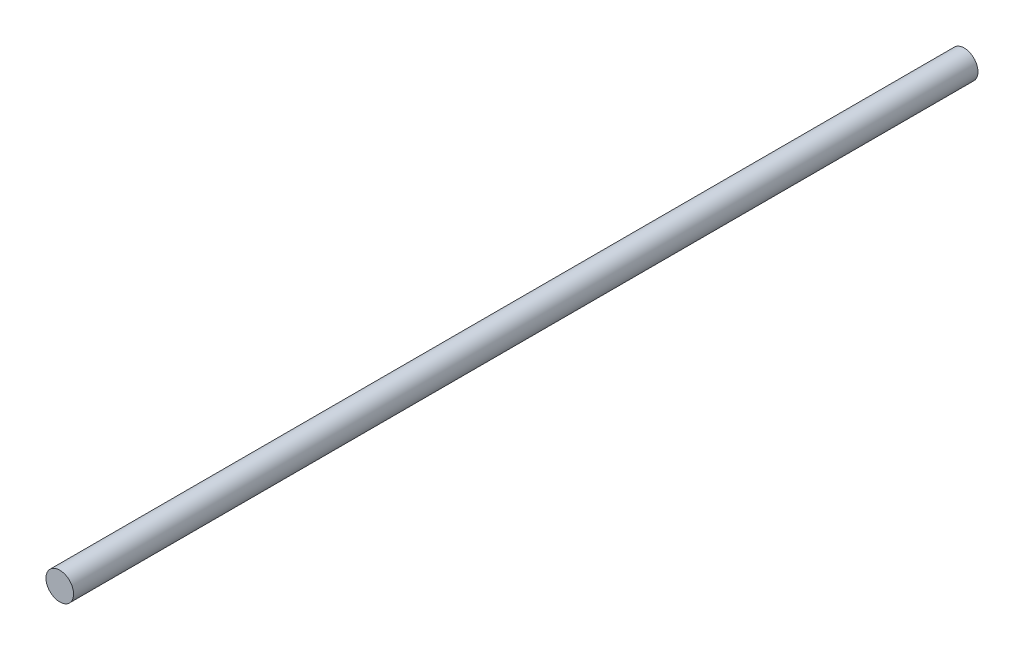
ISO-10303-21;
HEADER;
FILE_DESCRIPTION(('STEP AP214'),'2;1');
FILE_NAME('part.step','',(''),(''),'','','');
FILE_SCHEMA(('AUTOMOTIVE_DESIGN { 1 0 10303 214 1 1 1 1 }'));
ENDSEC;
DATA;
#1=APPLICATION_CONTEXT('core data for automotive mechanical design processes');
#2=APPLICATION_PROTOCOL_DEFINITION('international standard','automotive_design',2000,#1);
#3=PRODUCT_CONTEXT('',#1,'mechanical');
#4=PRODUCT('Part','Part','',(#3));
#5=PRODUCT_RELATED_PRODUCT_CATEGORY('part','',(#4));
#6=PRODUCT_DEFINITION_FORMATION('','',#4);
#7=PRODUCT_DEFINITION_CONTEXT('part definition',#1,'design');
#8=PRODUCT_DEFINITION('design','',#6,#7);
#9=PRODUCT_DEFINITION_SHAPE('','',#8);
#10=(LENGTH_UNIT() NAMED_UNIT(*) SI_UNIT(.MILLI.,.METRE.));
#11=(NAMED_UNIT(*) PLANE_ANGLE_UNIT() SI_UNIT($,.RADIAN.));
#12=(NAMED_UNIT(*) SI_UNIT($,.STERADIAN.) SOLID_ANGLE_UNIT());
#13=UNCERTAINTY_MEASURE_WITH_UNIT(LENGTH_MEASURE(1.E-05),#10,'distance_accuracy_value','');
#14=(GEOMETRIC_REPRESENTATION_CONTEXT(3) GLOBAL_UNCERTAINTY_ASSIGNED_CONTEXT((#13)) GLOBAL_UNIT_ASSIGNED_CONTEXT((#10,
#11,#12)) REPRESENTATION_CONTEXT('',''));
#15=CARTESIAN_POINT('',(0.,0.,0.));
#16=DIRECTION('',(0.,0.,1.));
#17=DIRECTION('',(1.,0.,0.));
#18=AXIS2_PLACEMENT_3D('',#15,#16,#17);
#19=CARTESIAN_POINT('',(0.,0.,328.));
#20=DIRECTION('',(0.,0.,-1.));
#21=DIRECTION('',(-1.,0.,0.));
#22=AXIS2_PLACEMENT_3D('',#19,#20,#21);
#23=CYLINDRICAL_SURFACE('',#22,5.);
#24=CARTESIAN_POINT('',(0.,0.,328.));
#25=DIRECTION('',(0.,0.,1.));
#26=DIRECTION('',(1.,0.,0.));
#27=AXIS2_PLACEMENT_3D('',#24,#25,#26);
#28=CIRCLE('',#27,5.);
#29=CARTESIAN_POINT('',(5.,0.,328.));
#30=VERTEX_POINT('',#29);
#31=EDGE_CURVE('E12',#30,#30,#28,.T.);
#32=ORIENTED_EDGE('',*,*,#31,.F.);
#33=EDGE_LOOP('',(#32));
#34=FACE_BOUND('',#33,.T.);
#35=CARTESIAN_POINT('',(0.,0.,0.));
#36=DIRECTION('',(0.,0.,1.));
#37=DIRECTION('',(1.,0.,0.));
#38=AXIS2_PLACEMENT_3D('',#35,#36,#37);
#39=CIRCLE('',#38,5.);
#40=CARTESIAN_POINT('',(5.,0.,0.));
#41=VERTEX_POINT('',#40);
#42=EDGE_CURVE('E50',#41,#41,#39,.T.);
#43=ORIENTED_EDGE('',*,*,#42,.T.);
#44=EDGE_LOOP('',(#43));
#45=FACE_BOUND('',#44,.T.);
#46=ADVANCED_FACE('F47',(#34,#45),#23,.T.);
#47=CARTESIAN_POINT('',(0.,0.,328.));
#48=DIRECTION('',(0.,0.,1.));
#49=DIRECTION('',(1.,0.,0.));
#50=AXIS2_PLACEMENT_3D('',#47,#48,#49);
#51=PLANE('',#50);
#52=ORIENTED_EDGE('',*,*,#31,.T.);
#53=EDGE_LOOP('',(#52));
#54=FACE_BOUND('',#53,.T.);
#55=ADVANCED_FACE('F62',(#54),#51,.T.);
#56=CARTESIAN_POINT('',(0.,0.,0.));
#57=DIRECTION('',(0.,0.,1.));
#58=DIRECTION('',(1.,0.,0.));
#59=AXIS2_PLACEMENT_3D('',#56,#57,#58);
#60=PLANE('',#59);
#61=ORIENTED_EDGE('',*,*,#42,.F.);
#62=EDGE_LOOP('',(#61));
#63=FACE_BOUND('',#62,.T.);
#64=ADVANCED_FACE('F60',(#63),#60,.F.);
#65=CLOSED_SHELL('',(#46,#55,#64));
#66=MANIFOLD_SOLID_BREP('B2',#65);
#67=ADVANCED_BREP_SHAPE_REPRESENTATION('',(#18,#66),#14);
#68=SHAPE_DEFINITION_REPRESENTATION(#9,#67);
ENDSEC;
END-ISO-10303-21;
